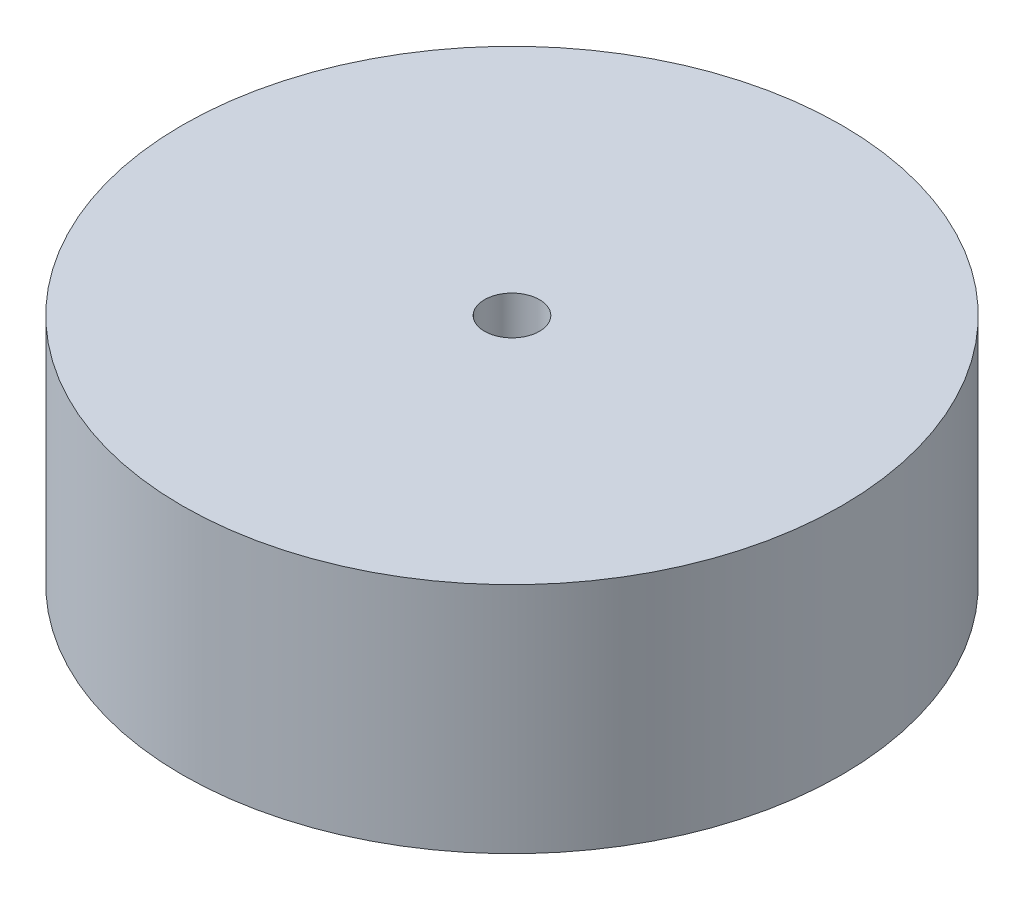
ISO-10303-21;
HEADER;
FILE_DESCRIPTION(('STEP AP214'),'2;1');
FILE_NAME('part.step','',(''),(''),'','','');
FILE_SCHEMA(('AUTOMOTIVE_DESIGN { 1 0 10303 214 1 1 1 1 }'));
ENDSEC;
DATA;
#1=APPLICATION_CONTEXT('core data for automotive mechanical design processes');
#2=APPLICATION_PROTOCOL_DEFINITION('international standard','automotive_design',2000,#1);
#3=PRODUCT_CONTEXT('',#1,'mechanical');
#4=PRODUCT('Part','Part','',(#3));
#5=PRODUCT_RELATED_PRODUCT_CATEGORY('part','',(#4));
#6=PRODUCT_DEFINITION_FORMATION('','',#4);
#7=PRODUCT_DEFINITION_CONTEXT('part definition',#1,'design');
#8=PRODUCT_DEFINITION('design','',#6,#7);
#9=PRODUCT_DEFINITION_SHAPE('','',#8);
#10=(LENGTH_UNIT() NAMED_UNIT(*) SI_UNIT(.MILLI.,.METRE.));
#11=(NAMED_UNIT(*) PLANE_ANGLE_UNIT() SI_UNIT($,.RADIAN.));
#12=(NAMED_UNIT(*) SI_UNIT($,.STERADIAN.) SOLID_ANGLE_UNIT());
#13=UNCERTAINTY_MEASURE_WITH_UNIT(LENGTH_MEASURE(1.E-05),#10,'distance_accuracy_value','');
#14=(GEOMETRIC_REPRESENTATION_CONTEXT(3) GLOBAL_UNCERTAINTY_ASSIGNED_CONTEXT((#13)) GLOBAL_UNIT_ASSIGNED_CONTEXT((#10,
#11,#12)) REPRESENTATION_CONTEXT('',''));
#15=CARTESIAN_POINT('',(0.,0.,0.));
#16=DIRECTION('',(0.,0.,1.));
#17=DIRECTION('',(1.,0.,0.));
#18=AXIS2_PLACEMENT_3D('',#15,#16,#17);
#19=CARTESIAN_POINT('',(0.,26.924,0.));
#20=DIRECTION('',(0.,-1.,0.));
#21=DIRECTION('',(0.,0.,-1.));
#22=AXIS2_PLACEMENT_3D('',#19,#20,#21);
#23=CYLINDRICAL_SURFACE('',#22,38.1);
#24=CARTESIAN_POINT('',(0.,26.924,0.));
#25=DIRECTION('',(0.,1.,0.));
#26=DIRECTION('',(0.,0.,1.));
#27=AXIS2_PLACEMENT_3D('',#24,#25,#26);
#28=CIRCLE('',#27,38.1);
#29=CARTESIAN_POINT('',(0.,26.924,38.1));
#30=VERTEX_POINT('',#29);
#31=EDGE_CURVE('E10',#30,#30,#28,.T.);
#32=ORIENTED_EDGE('',*,*,#31,.F.);
#33=EDGE_LOOP('',(#32));
#34=FACE_BOUND('',#33,.T.);
#35=CARTESIAN_POINT('',(0.,0.,0.));
#36=DIRECTION('',(0.,1.,0.));
#37=DIRECTION('',(0.,0.,1.));
#38=AXIS2_PLACEMENT_3D('',#35,#36,#37);
#39=CIRCLE('',#38,38.1);
#40=CARTESIAN_POINT('',(0.,0.,38.1));
#41=VERTEX_POINT('',#40);
#42=EDGE_CURVE('E35',#41,#41,#39,.T.);
#43=ORIENTED_EDGE('',*,*,#42,.T.);
#44=EDGE_LOOP('',(#43));
#45=FACE_BOUND('',#44,.T.);
#46=ADVANCED_FACE('F32',(#34,#45),#23,.T.);
#47=CARTESIAN_POINT('',(0.,26.924,0.));
#48=DIRECTION('',(0.,1.,0.));
#49=DIRECTION('',(0.,0.,1.));
#50=AXIS2_PLACEMENT_3D('',#47,#48,#49);
#51=PLANE('',#50);
#52=CARTESIAN_POINT('',(0.,26.924,0.));
#53=DIRECTION('',(0.,1.,0.));
#54=DIRECTION('',(0.,0.,1.));
#55=AXIS2_PLACEMENT_3D('',#52,#53,#54);
#56=CIRCLE('',#55,3.17499999999999);
#57=CARTESIAN_POINT('',(0.,26.924,3.17499999999999));
#58=VERTEX_POINT('',#57);
#59=EDGE_CURVE('E46',#58,#58,#56,.T.);
#60=ORIENTED_EDGE('',*,*,#59,.F.);
#61=EDGE_LOOP('',(#60));
#62=FACE_BOUND('',#61,.T.);
#63=ORIENTED_EDGE('',*,*,#31,.T.);
#64=EDGE_LOOP('',(#63));
#65=FACE_BOUND('',#64,.T.);
#66=ADVANCED_FACE('F52',(#62,#65),#51,.T.);
#67=CARTESIAN_POINT('',(0.,0.,0.));
#68=DIRECTION('',(0.,1.,0.));
#69=DIRECTION('',(0.,0.,1.));
#70=AXIS2_PLACEMENT_3D('',#67,#68,#69);
#71=PLANE('',#70);
#72=CARTESIAN_POINT('',(0.,0.,0.));
#73=DIRECTION('',(0.,1.,0.));
#74=DIRECTION('',(0.,0.,1.));
#75=AXIS2_PLACEMENT_3D('',#72,#73,#74);
#76=CIRCLE('',#75,3.175);
#77=CARTESIAN_POINT('',(0.,0.,3.175));
#78=VERTEX_POINT('',#77);
#79=EDGE_CURVE('E42',#78,#78,#76,.T.);
#80=ORIENTED_EDGE('',*,*,#79,.T.);
#81=EDGE_LOOP('',(#80));
#82=FACE_BOUND('',#81,.T.);
#83=ORIENTED_EDGE('',*,*,#42,.F.);
#84=EDGE_LOOP('',(#83));
#85=FACE_BOUND('',#84,.T.);
#86=ADVANCED_FACE('F54',(#82,#85),#71,.F.);
#87=CARTESIAN_POINT('',(0.,26.924,0.));
#88=DIRECTION('',(0.,1.,0.));
#89=DIRECTION('',(0.,0.,1.));
#90=AXIS2_PLACEMENT_3D('',#87,#88,#89);
#91=CYLINDRICAL_SURFACE('',#90,3.17499999999999);
#92=ORIENTED_EDGE('',*,*,#79,.F.);
#93=EDGE_LOOP('',(#92));
#94=FACE_BOUND('',#93,.T.);
#95=ORIENTED_EDGE('',*,*,#59,.T.);
#96=EDGE_LOOP('',(#95));
#97=FACE_BOUND('',#96,.T.);
#98=ADVANCED_FACE('F50',(#94,#97),#91,.F.);
#99=CLOSED_SHELL('',(#46,#66,#86,#98));
#100=MANIFOLD_SOLID_BREP('B2',#99);
#101=ADVANCED_BREP_SHAPE_REPRESENTATION('',(#18,#100),#14);
#102=SHAPE_DEFINITION_REPRESENTATION(#9,#101);
ENDSEC;
END-ISO-10303-21;
